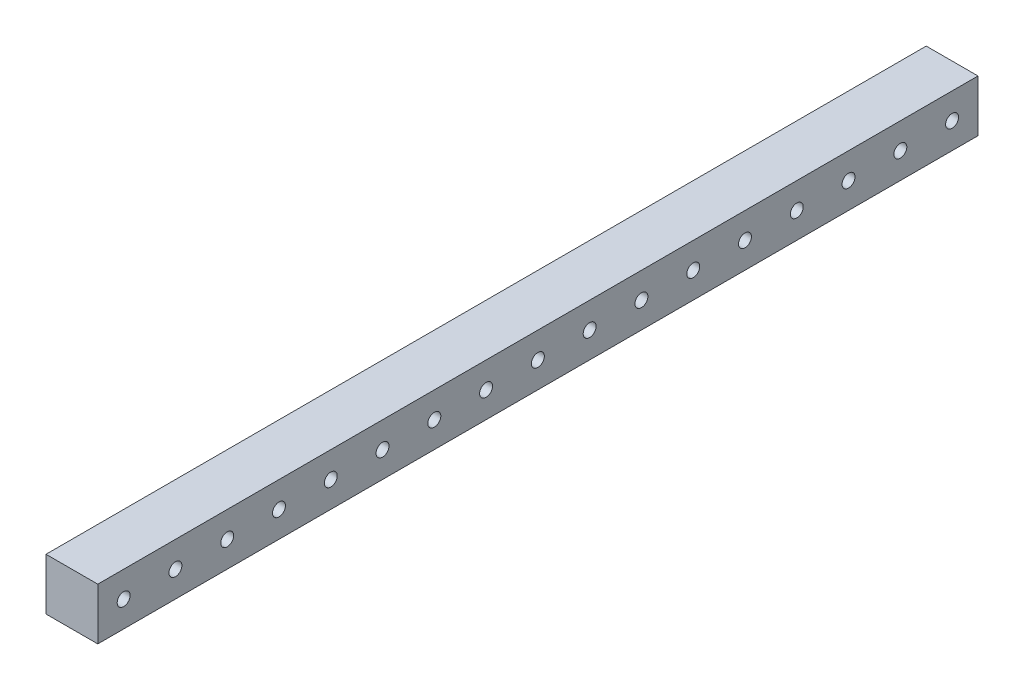
ISO-10303-21;
HEADER;
FILE_DESCRIPTION(('STEP AP214'),'2;1');
FILE_NAME('part.step','',(''),(''),'','','');
FILE_SCHEMA(('AUTOMOTIVE_DESIGN { 1 0 10303 214 1 1 1 1 }'));
ENDSEC;
DATA;
#1=APPLICATION_CONTEXT('core data for automotive mechanical design processes');
#2=APPLICATION_PROTOCOL_DEFINITION('international standard','automotive_design',2000,#1);
#3=PRODUCT_CONTEXT('',#1,'mechanical');
#4=PRODUCT('Part','Part','',(#3));
#5=PRODUCT_RELATED_PRODUCT_CATEGORY('part','',(#4));
#6=PRODUCT_DEFINITION_FORMATION('','',#4);
#7=PRODUCT_DEFINITION_CONTEXT('part definition',#1,'design');
#8=PRODUCT_DEFINITION('design','',#6,#7);
#9=PRODUCT_DEFINITION_SHAPE('','',#8);
#10=(LENGTH_UNIT() NAMED_UNIT(*) SI_UNIT(.MILLI.,.METRE.));
#11=(NAMED_UNIT(*) PLANE_ANGLE_UNIT() SI_UNIT($,.RADIAN.));
#12=(NAMED_UNIT(*) SI_UNIT($,.STERADIAN.) SOLID_ANGLE_UNIT());
#13=UNCERTAINTY_MEASURE_WITH_UNIT(LENGTH_MEASURE(1.E-05),#10,'distance_accuracy_value','');
#14=(GEOMETRIC_REPRESENTATION_CONTEXT(3) GLOBAL_UNCERTAINTY_ASSIGNED_CONTEXT((#13)) GLOBAL_UNIT_ASSIGNED_CONTEXT((#10,
#11,#12)) REPRESENTATION_CONTEXT('',''));
#15=CARTESIAN_POINT('',(0.,0.,0.));
#16=DIRECTION('',(0.,0.,1.));
#17=DIRECTION('',(1.,0.,0.));
#18=AXIS2_PLACEMENT_3D('',#15,#16,#17);
#19=CARTESIAN_POINT('',(10.,0.,330.));
#20=DIRECTION('',(1.,0.,0.));
#21=DIRECTION('',(0.,0.,-1.));
#22=AXIS2_PLACEMENT_3D('',#19,#20,#21);
#23=CYLINDRICAL_SURFACE('',#22,2.5);
#24=CARTESIAN_POINT('',(-10.,0.,330.));
#25=DIRECTION('',(1.,0.,0.));
#26=DIRECTION('',(0.,0.,-1.));
#27=AXIS2_PLACEMENT_3D('',#24,#25,#26);
#28=CIRCLE('',#27,2.5);
#29=CARTESIAN_POINT('',(-10.,0.,327.5));
#30=VERTEX_POINT('',#29);
#31=EDGE_CURVE('E40',#30,#30,#28,.T.);
#32=ORIENTED_EDGE('',*,*,#31,.F.);
#33=EDGE_LOOP('',(#32));
#34=FACE_BOUND('',#33,.T.);
#35=CARTESIAN_POINT('',(10.,0.,330.));
#36=DIRECTION('',(1.,0.,0.));
#37=DIRECTION('',(0.,0.,-1.));
#38=AXIS2_PLACEMENT_3D('',#35,#36,#37);
#39=CIRCLE('',#38,2.5);
#40=CARTESIAN_POINT('',(10.,0.,327.5));
#41=VERTEX_POINT('',#40);
#42=EDGE_CURVE('E11',#41,#41,#39,.T.);
#43=ORIENTED_EDGE('',*,*,#42,.T.);
#44=EDGE_LOOP('',(#43));
#45=FACE_BOUND('',#44,.T.);
#46=ADVANCED_FACE('F32',(#34,#45),#23,.F.);
#47=CARTESIAN_POINT('',(10.,0.,310.));
#48=DIRECTION('',(1.,0.,0.));
#49=DIRECTION('',(0.,0.,-1.));
#50=AXIS2_PLACEMENT_3D('',#47,#48,#49);
#51=CYLINDRICAL_SURFACE('',#50,2.5);
#52=CARTESIAN_POINT('',(-10.,0.,310.));
#53=DIRECTION('',(1.,0.,0.));
#54=DIRECTION('',(0.,0.,-1.));
#55=AXIS2_PLACEMENT_3D('',#52,#53,#54);
#56=CIRCLE('',#55,2.5);
#57=CARTESIAN_POINT('',(-10.,0.,307.5));
#58=VERTEX_POINT('',#57);
#59=EDGE_CURVE('E188',#58,#58,#56,.T.);
#60=ORIENTED_EDGE('',*,*,#59,.F.);
#61=EDGE_LOOP('',(#60));
#62=FACE_BOUND('',#61,.T.);
#63=CARTESIAN_POINT('',(10.,0.,310.));
#64=DIRECTION('',(1.,0.,0.));
#65=DIRECTION('',(0.,0.,-1.));
#66=AXIS2_PLACEMENT_3D('',#63,#64,#65);
#67=CIRCLE('',#66,2.5);
#68=CARTESIAN_POINT('',(10.,0.,307.5));
#69=VERTEX_POINT('',#68);
#70=EDGE_CURVE('E191',#69,#69,#67,.T.);
#71=ORIENTED_EDGE('',*,*,#70,.T.);
#72=EDGE_LOOP('',(#71));
#73=FACE_BOUND('',#72,.T.);
#74=ADVANCED_FACE('F200',(#62,#73),#51,.F.);
#75=CARTESIAN_POINT('',(10.,0.,290.));
#76=DIRECTION('',(1.,0.,0.));
#77=DIRECTION('',(0.,0.,-1.));
#78=AXIS2_PLACEMENT_3D('',#75,#76,#77);
#79=CYLINDRICAL_SURFACE('',#78,2.5);
#80=CARTESIAN_POINT('',(-10.,0.,290.));
#81=DIRECTION('',(1.,0.,0.));
#82=DIRECTION('',(0.,0.,-1.));
#83=AXIS2_PLACEMENT_3D('',#80,#81,#82);
#84=CIRCLE('',#83,2.5);
#85=CARTESIAN_POINT('',(-10.,0.,287.5));
#86=VERTEX_POINT('',#85);
#87=EDGE_CURVE('E182',#86,#86,#84,.T.);
#88=ORIENTED_EDGE('',*,*,#87,.F.);
#89=EDGE_LOOP('',(#88));
#90=FACE_BOUND('',#89,.T.);
#91=CARTESIAN_POINT('',(10.,0.,290.));
#92=DIRECTION('',(1.,0.,0.));
#93=DIRECTION('',(0.,0.,-1.));
#94=AXIS2_PLACEMENT_3D('',#91,#92,#93);
#95=CIRCLE('',#94,2.5);
#96=CARTESIAN_POINT('',(10.,0.,287.5));
#97=VERTEX_POINT('',#96);
#98=EDGE_CURVE('E185',#97,#97,#95,.T.);
#99=ORIENTED_EDGE('',*,*,#98,.T.);
#100=EDGE_LOOP('',(#99));
#101=FACE_BOUND('',#100,.T.);
#102=ADVANCED_FACE('F267',(#90,#101),#79,.F.);
#103=CARTESIAN_POINT('',(10.,0.,270.));
#104=DIRECTION('',(1.,0.,0.));
#105=DIRECTION('',(0.,0.,-1.));
#106=AXIS2_PLACEMENT_3D('',#103,#104,#105);
#107=CYLINDRICAL_SURFACE('',#106,2.5);
#108=CARTESIAN_POINT('',(-10.,0.,270.));
#109=DIRECTION('',(1.,0.,0.));
#110=DIRECTION('',(0.,0.,-1.));
#111=AXIS2_PLACEMENT_3D('',#108,#109,#110);
#112=CIRCLE('',#111,2.5);
#113=CARTESIAN_POINT('',(-10.,0.,267.5));
#114=VERTEX_POINT('',#113);
#115=EDGE_CURVE('E176',#114,#114,#112,.T.);
#116=ORIENTED_EDGE('',*,*,#115,.F.);
#117=EDGE_LOOP('',(#116));
#118=FACE_BOUND('',#117,.T.);
#119=CARTESIAN_POINT('',(10.,0.,270.));
#120=DIRECTION('',(1.,0.,0.));
#121=DIRECTION('',(0.,0.,-1.));
#122=AXIS2_PLACEMENT_3D('',#119,#120,#121);
#123=CIRCLE('',#122,2.5);
#124=CARTESIAN_POINT('',(10.,0.,267.5));
#125=VERTEX_POINT('',#124);
#126=EDGE_CURVE('E179',#125,#125,#123,.T.);
#127=ORIENTED_EDGE('',*,*,#126,.T.);
#128=EDGE_LOOP('',(#127));
#129=FACE_BOUND('',#128,.T.);
#130=ADVANCED_FACE('F263',(#118,#129),#107,.F.);
#131=CARTESIAN_POINT('',(10.,0.,250.));
#132=DIRECTION('',(1.,0.,0.));
#133=DIRECTION('',(0.,0.,-1.));
#134=AXIS2_PLACEMENT_3D('',#131,#132,#133);
#135=CYLINDRICAL_SURFACE('',#134,2.5);
#136=CARTESIAN_POINT('',(-10.,0.,250.));
#137=DIRECTION('',(1.,0.,0.));
#138=DIRECTION('',(0.,0.,-1.));
#139=AXIS2_PLACEMENT_3D('',#136,#137,#138);
#140=CIRCLE('',#139,2.5);
#141=CARTESIAN_POINT('',(-10.,0.,247.5));
#142=VERTEX_POINT('',#141);
#143=EDGE_CURVE('E170',#142,#142,#140,.T.);
#144=ORIENTED_EDGE('',*,*,#143,.F.);
#145=EDGE_LOOP('',(#144));
#146=FACE_BOUND('',#145,.T.);
#147=CARTESIAN_POINT('',(10.,0.,250.));
#148=DIRECTION('',(1.,0.,0.));
#149=DIRECTION('',(0.,0.,-1.));
#150=AXIS2_PLACEMENT_3D('',#147,#148,#149);
#151=CIRCLE('',#150,2.5);
#152=CARTESIAN_POINT('',(10.,0.,247.5));
#153=VERTEX_POINT('',#152);
#154=EDGE_CURVE('E173',#153,#153,#151,.T.);
#155=ORIENTED_EDGE('',*,*,#154,.T.);
#156=EDGE_LOOP('',(#155));
#157=FACE_BOUND('',#156,.T.);
#158=ADVANCED_FACE('F259',(#146,#157),#135,.F.);
#159=CARTESIAN_POINT('',(10.,0.,230.));
#160=DIRECTION('',(1.,0.,0.));
#161=DIRECTION('',(0.,0.,-1.));
#162=AXIS2_PLACEMENT_3D('',#159,#160,#161);
#163=CYLINDRICAL_SURFACE('',#162,2.5);
#164=CARTESIAN_POINT('',(-10.,0.,230.));
#165=DIRECTION('',(1.,0.,0.));
#166=DIRECTION('',(0.,0.,-1.));
#167=AXIS2_PLACEMENT_3D('',#164,#165,#166);
#168=CIRCLE('',#167,2.5);
#169=CARTESIAN_POINT('',(-10.,0.,227.5));
#170=VERTEX_POINT('',#169);
#171=EDGE_CURVE('E164',#170,#170,#168,.T.);
#172=ORIENTED_EDGE('',*,*,#171,.F.);
#173=EDGE_LOOP('',(#172));
#174=FACE_BOUND('',#173,.T.);
#175=CARTESIAN_POINT('',(10.,0.,230.));
#176=DIRECTION('',(1.,0.,0.));
#177=DIRECTION('',(0.,0.,-1.));
#178=AXIS2_PLACEMENT_3D('',#175,#176,#177);
#179=CIRCLE('',#178,2.5);
#180=CARTESIAN_POINT('',(10.,0.,227.5));
#181=VERTEX_POINT('',#180);
#182=EDGE_CURVE('E167',#181,#181,#179,.T.);
#183=ORIENTED_EDGE('',*,*,#182,.T.);
#184=EDGE_LOOP('',(#183));
#185=FACE_BOUND('',#184,.T.);
#186=ADVANCED_FACE('F255',(#174,#185),#163,.F.);
#187=CARTESIAN_POINT('',(10.,0.,210.));
#188=DIRECTION('',(1.,0.,0.));
#189=DIRECTION('',(0.,0.,-1.));
#190=AXIS2_PLACEMENT_3D('',#187,#188,#189);
#191=CYLINDRICAL_SURFACE('',#190,2.5);
#192=CARTESIAN_POINT('',(-10.,0.,210.));
#193=DIRECTION('',(1.,0.,0.));
#194=DIRECTION('',(0.,0.,-1.));
#195=AXIS2_PLACEMENT_3D('',#192,#193,#194);
#196=CIRCLE('',#195,2.5);
#197=CARTESIAN_POINT('',(-10.,0.,207.5));
#198=VERTEX_POINT('',#197);
#199=EDGE_CURVE('E158',#198,#198,#196,.T.);
#200=ORIENTED_EDGE('',*,*,#199,.F.);
#201=EDGE_LOOP('',(#200));
#202=FACE_BOUND('',#201,.T.);
#203=CARTESIAN_POINT('',(10.,0.,210.));
#204=DIRECTION('',(1.,0.,0.));
#205=DIRECTION('',(0.,0.,-1.));
#206=AXIS2_PLACEMENT_3D('',#203,#204,#205);
#207=CIRCLE('',#206,2.5);
#208=CARTESIAN_POINT('',(10.,0.,207.5));
#209=VERTEX_POINT('',#208);
#210=EDGE_CURVE('E161',#209,#209,#207,.T.);
#211=ORIENTED_EDGE('',*,*,#210,.T.);
#212=EDGE_LOOP('',(#211));
#213=FACE_BOUND('',#212,.T.);
#214=ADVANCED_FACE('F251',(#202,#213),#191,.F.);
#215=CARTESIAN_POINT('',(10.,0.,190.));
#216=DIRECTION('',(1.,0.,0.));
#217=DIRECTION('',(0.,0.,-1.));
#218=AXIS2_PLACEMENT_3D('',#215,#216,#217);
#219=CYLINDRICAL_SURFACE('',#218,2.5);
#220=CARTESIAN_POINT('',(-10.,0.,190.));
#221=DIRECTION('',(1.,0.,0.));
#222=DIRECTION('',(0.,0.,-1.));
#223=AXIS2_PLACEMENT_3D('',#220,#221,#222);
#224=CIRCLE('',#223,2.5);
#225=CARTESIAN_POINT('',(-10.,0.,187.5));
#226=VERTEX_POINT('',#225);
#227=EDGE_CURVE('E152',#226,#226,#224,.T.);
#228=ORIENTED_EDGE('',*,*,#227,.F.);
#229=EDGE_LOOP('',(#228));
#230=FACE_BOUND('',#229,.T.);
#231=CARTESIAN_POINT('',(10.,0.,190.));
#232=DIRECTION('',(1.,0.,0.));
#233=DIRECTION('',(0.,0.,-1.));
#234=AXIS2_PLACEMENT_3D('',#231,#232,#233);
#235=CIRCLE('',#234,2.5);
#236=CARTESIAN_POINT('',(10.,0.,187.5));
#237=VERTEX_POINT('',#236);
#238=EDGE_CURVE('E155',#237,#237,#235,.T.);
#239=ORIENTED_EDGE('',*,*,#238,.T.);
#240=EDGE_LOOP('',(#239));
#241=FACE_BOUND('',#240,.T.);
#242=ADVANCED_FACE('F247',(#230,#241),#219,.F.);
#243=CARTESIAN_POINT('',(10.,0.,170.));
#244=DIRECTION('',(1.,0.,0.));
#245=DIRECTION('',(0.,0.,-1.));
#246=AXIS2_PLACEMENT_3D('',#243,#244,#245);
#247=CYLINDRICAL_SURFACE('',#246,2.5);
#248=CARTESIAN_POINT('',(-10.,0.,170.));
#249=DIRECTION('',(1.,0.,0.));
#250=DIRECTION('',(0.,0.,-1.));
#251=AXIS2_PLACEMENT_3D('',#248,#249,#250);
#252=CIRCLE('',#251,2.5);
#253=CARTESIAN_POINT('',(-10.,0.,167.5));
#254=VERTEX_POINT('',#253);
#255=EDGE_CURVE('E146',#254,#254,#252,.T.);
#256=ORIENTED_EDGE('',*,*,#255,.F.);
#257=EDGE_LOOP('',(#256));
#258=FACE_BOUND('',#257,.T.);
#259=CARTESIAN_POINT('',(10.,0.,170.));
#260=DIRECTION('',(1.,0.,0.));
#261=DIRECTION('',(0.,0.,-1.));
#262=AXIS2_PLACEMENT_3D('',#259,#260,#261);
#263=CIRCLE('',#262,2.5);
#264=CARTESIAN_POINT('',(10.,0.,167.5));
#265=VERTEX_POINT('',#264);
#266=EDGE_CURVE('E149',#265,#265,#263,.T.);
#267=ORIENTED_EDGE('',*,*,#266,.T.);
#268=EDGE_LOOP('',(#267));
#269=FACE_BOUND('',#268,.T.);
#270=ADVANCED_FACE('F243',(#258,#269),#247,.F.);
#271=CARTESIAN_POINT('',(10.,0.,150.));
#272=DIRECTION('',(1.,0.,0.));
#273=DIRECTION('',(0.,0.,-1.));
#274=AXIS2_PLACEMENT_3D('',#271,#272,#273);
#275=CYLINDRICAL_SURFACE('',#274,2.5);
#276=CARTESIAN_POINT('',(-10.,0.,150.));
#277=DIRECTION('',(1.,0.,0.));
#278=DIRECTION('',(0.,0.,-1.));
#279=AXIS2_PLACEMENT_3D('',#276,#277,#278);
#280=CIRCLE('',#279,2.5);
#281=CARTESIAN_POINT('',(-10.,0.,147.5));
#282=VERTEX_POINT('',#281);
#283=EDGE_CURVE('E140',#282,#282,#280,.T.);
#284=ORIENTED_EDGE('',*,*,#283,.F.);
#285=EDGE_LOOP('',(#284));
#286=FACE_BOUND('',#285,.T.);
#287=CARTESIAN_POINT('',(10.,0.,150.));
#288=DIRECTION('',(1.,0.,0.));
#289=DIRECTION('',(0.,0.,-1.));
#290=AXIS2_PLACEMENT_3D('',#287,#288,#289);
#291=CIRCLE('',#290,2.5);
#292=CARTESIAN_POINT('',(10.,0.,147.5));
#293=VERTEX_POINT('',#292);
#294=EDGE_CURVE('E143',#293,#293,#291,.T.);
#295=ORIENTED_EDGE('',*,*,#294,.T.);
#296=EDGE_LOOP('',(#295));
#297=FACE_BOUND('',#296,.T.);
#298=ADVANCED_FACE('F239',(#286,#297),#275,.F.);
#299=CARTESIAN_POINT('',(10.,0.,130.));
#300=DIRECTION('',(1.,0.,0.));
#301=DIRECTION('',(0.,0.,-1.));
#302=AXIS2_PLACEMENT_3D('',#299,#300,#301);
#303=CYLINDRICAL_SURFACE('',#302,2.5);
#304=CARTESIAN_POINT('',(-10.,0.,130.));
#305=DIRECTION('',(1.,0.,0.));
#306=DIRECTION('',(0.,0.,-1.));
#307=AXIS2_PLACEMENT_3D('',#304,#305,#306);
#308=CIRCLE('',#307,2.5);
#309=CARTESIAN_POINT('',(-10.,0.,127.5));
#310=VERTEX_POINT('',#309);
#311=EDGE_CURVE('E134',#310,#310,#308,.T.);
#312=ORIENTED_EDGE('',*,*,#311,.F.);
#313=EDGE_LOOP('',(#312));
#314=FACE_BOUND('',#313,.T.);
#315=CARTESIAN_POINT('',(10.,0.,130.));
#316=DIRECTION('',(1.,0.,0.));
#317=DIRECTION('',(0.,0.,-1.));
#318=AXIS2_PLACEMENT_3D('',#315,#316,#317);
#319=CIRCLE('',#318,2.5);
#320=CARTESIAN_POINT('',(10.,0.,127.5));
#321=VERTEX_POINT('',#320);
#322=EDGE_CURVE('E137',#321,#321,#319,.T.);
#323=ORIENTED_EDGE('',*,*,#322,.T.);
#324=EDGE_LOOP('',(#323));
#325=FACE_BOUND('',#324,.T.);
#326=ADVANCED_FACE('F235',(#314,#325),#303,.F.);
#327=CARTESIAN_POINT('',(10.,0.,110.));
#328=DIRECTION('',(1.,0.,0.));
#329=DIRECTION('',(0.,0.,-1.));
#330=AXIS2_PLACEMENT_3D('',#327,#328,#329);
#331=CYLINDRICAL_SURFACE('',#330,2.5);
#332=CARTESIAN_POINT('',(-10.,0.,110.));
#333=DIRECTION('',(1.,0.,0.));
#334=DIRECTION('',(0.,0.,-1.));
#335=AXIS2_PLACEMENT_3D('',#332,#333,#334);
#336=CIRCLE('',#335,2.5);
#337=CARTESIAN_POINT('',(-10.,0.,107.5));
#338=VERTEX_POINT('',#337);
#339=EDGE_CURVE('E128',#338,#338,#336,.T.);
#340=ORIENTED_EDGE('',*,*,#339,.F.);
#341=EDGE_LOOP('',(#340));
#342=FACE_BOUND('',#341,.T.);
#343=CARTESIAN_POINT('',(10.,0.,110.));
#344=DIRECTION('',(1.,0.,0.));
#345=DIRECTION('',(0.,0.,-1.));
#346=AXIS2_PLACEMENT_3D('',#343,#344,#345);
#347=CIRCLE('',#346,2.5);
#348=CARTESIAN_POINT('',(10.,0.,107.5));
#349=VERTEX_POINT('',#348);
#350=EDGE_CURVE('E131',#349,#349,#347,.T.);
#351=ORIENTED_EDGE('',*,*,#350,.T.);
#352=EDGE_LOOP('',(#351));
#353=FACE_BOUND('',#352,.T.);
#354=ADVANCED_FACE('F231',(#342,#353),#331,.F.);
#355=CARTESIAN_POINT('',(10.,0.,90.));
#356=DIRECTION('',(1.,0.,0.));
#357=DIRECTION('',(0.,0.,-1.));
#358=AXIS2_PLACEMENT_3D('',#355,#356,#357);
#359=CYLINDRICAL_SURFACE('',#358,2.5);
#360=CARTESIAN_POINT('',(-10.,0.,90.));
#361=DIRECTION('',(1.,0.,0.));
#362=DIRECTION('',(0.,0.,-1.));
#363=AXIS2_PLACEMENT_3D('',#360,#361,#362);
#364=CIRCLE('',#363,2.5);
#365=CARTESIAN_POINT('',(-10.,0.,87.5));
#366=VERTEX_POINT('',#365);
#367=EDGE_CURVE('E122',#366,#366,#364,.T.);
#368=ORIENTED_EDGE('',*,*,#367,.F.);
#369=EDGE_LOOP('',(#368));
#370=FACE_BOUND('',#369,.T.);
#371=CARTESIAN_POINT('',(10.,0.,90.));
#372=DIRECTION('',(1.,0.,0.));
#373=DIRECTION('',(0.,0.,-1.));
#374=AXIS2_PLACEMENT_3D('',#371,#372,#373);
#375=CIRCLE('',#374,2.5);
#376=CARTESIAN_POINT('',(10.,0.,87.5));
#377=VERTEX_POINT('',#376);
#378=EDGE_CURVE('E125',#377,#377,#375,.T.);
#379=ORIENTED_EDGE('',*,*,#378,.T.);
#380=EDGE_LOOP('',(#379));
#381=FACE_BOUND('',#380,.T.);
#382=ADVANCED_FACE('F227',(#370,#381),#359,.F.);
#383=CARTESIAN_POINT('',(10.,0.,70.));
#384=DIRECTION('',(1.,0.,0.));
#385=DIRECTION('',(0.,0.,-1.));
#386=AXIS2_PLACEMENT_3D('',#383,#384,#385);
#387=CYLINDRICAL_SURFACE('',#386,2.5);
#388=CARTESIAN_POINT('',(-10.,0.,70.));
#389=DIRECTION('',(1.,0.,0.));
#390=DIRECTION('',(0.,0.,-1.));
#391=AXIS2_PLACEMENT_3D('',#388,#389,#390);
#392=CIRCLE('',#391,2.5);
#393=CARTESIAN_POINT('',(-10.,0.,67.5));
#394=VERTEX_POINT('',#393);
#395=EDGE_CURVE('E116',#394,#394,#392,.T.);
#396=ORIENTED_EDGE('',*,*,#395,.F.);
#397=EDGE_LOOP('',(#396));
#398=FACE_BOUND('',#397,.T.);
#399=CARTESIAN_POINT('',(10.,0.,70.));
#400=DIRECTION('',(1.,0.,0.));
#401=DIRECTION('',(0.,0.,-1.));
#402=AXIS2_PLACEMENT_3D('',#399,#400,#401);
#403=CIRCLE('',#402,2.5);
#404=CARTESIAN_POINT('',(10.,0.,67.5));
#405=VERTEX_POINT('',#404);
#406=EDGE_CURVE('E119',#405,#405,#403,.T.);
#407=ORIENTED_EDGE('',*,*,#406,.T.);
#408=EDGE_LOOP('',(#407));
#409=FACE_BOUND('',#408,.T.);
#410=ADVANCED_FACE('F223',(#398,#409),#387,.F.);
#411=CARTESIAN_POINT('',(10.,0.,50.));
#412=DIRECTION('',(1.,0.,0.));
#413=DIRECTION('',(0.,0.,-1.));
#414=AXIS2_PLACEMENT_3D('',#411,#412,#413);
#415=CYLINDRICAL_SURFACE('',#414,2.5);
#416=CARTESIAN_POINT('',(-10.,0.,50.));
#417=DIRECTION('',(1.,0.,0.));
#418=DIRECTION('',(0.,0.,-1.));
#419=AXIS2_PLACEMENT_3D('',#416,#417,#418);
#420=CIRCLE('',#419,2.5);
#421=CARTESIAN_POINT('',(-10.,0.,47.5));
#422=VERTEX_POINT('',#421);
#423=EDGE_CURVE('E110',#422,#422,#420,.T.);
#424=ORIENTED_EDGE('',*,*,#423,.F.);
#425=EDGE_LOOP('',(#424));
#426=FACE_BOUND('',#425,.T.);
#427=CARTESIAN_POINT('',(10.,0.,50.));
#428=DIRECTION('',(1.,0.,0.));
#429=DIRECTION('',(0.,0.,-1.));
#430=AXIS2_PLACEMENT_3D('',#427,#428,#429);
#431=CIRCLE('',#430,2.5);
#432=CARTESIAN_POINT('',(10.,0.,47.5));
#433=VERTEX_POINT('',#432);
#434=EDGE_CURVE('E113',#433,#433,#431,.T.);
#435=ORIENTED_EDGE('',*,*,#434,.T.);
#436=EDGE_LOOP('',(#435));
#437=FACE_BOUND('',#436,.T.);
#438=ADVANCED_FACE('F219',(#426,#437),#415,.F.);
#439=CARTESIAN_POINT('',(-10.,10.0000000000001,340.));
#440=DIRECTION('',(1.,0.,0.));
#441=DIRECTION('',(0.,1.,0.));
#442=AXIS2_PLACEMENT_3D('',#439,#440,#441);
#443=PLANE('',#442);
#444=CARTESIAN_POINT('',(-10.,0.,30.));
#445=DIRECTION('',(1.,0.,0.));
#446=DIRECTION('',(0.,0.,-1.));
#447=AXIS2_PLACEMENT_3D('',#444,#445,#446);
#448=CIRCLE('',#447,2.5);
#449=CARTESIAN_POINT('',(-10.,0.,27.5));
#450=VERTEX_POINT('',#449);
#451=EDGE_CURVE('E428',#450,#450,#448,.T.);
#452=ORIENTED_EDGE('',*,*,#451,.T.);
#453=EDGE_LOOP('',(#452));
#454=FACE_BOUND('',#453,.T.);
#455=CARTESIAN_POINT('',(-10.,0.,10.));
#456=DIRECTION('',(1.,0.,0.));
#457=DIRECTION('',(0.,0.,-1.));
#458=AXIS2_PLACEMENT_3D('',#455,#456,#457);
#459=CIRCLE('',#458,2.5);
#460=CARTESIAN_POINT('',(-10.,0.,7.50000000000001));
#461=VERTEX_POINT('',#460);
#462=EDGE_CURVE('E103',#461,#461,#459,.T.);
#463=ORIENTED_EDGE('',*,*,#462,.T.);
#464=EDGE_LOOP('',(#463));
#465=FACE_BOUND('',#464,.T.);
#466=DIRECTION('',(0.,-1.,0.));
#467=VECTOR('',#466,1.);
#468=CARTESIAN_POINT('',(-10.,10.0000000000001,0.));
#469=LINE('',#468,#467);
#470=CARTESIAN_POINT('',(-10.,10.0000000000001,0.));
#471=VERTEX_POINT('',#470);
#472=CARTESIAN_POINT('',(-10.,-10.0000000000001,0.));
#473=VERTEX_POINT('',#472);
#474=EDGE_CURVE('E100',#471,#473,#469,.T.);
#475=ORIENTED_EDGE('',*,*,#474,.T.);
#476=DIRECTION('',(0.,0.,-1.));
#477=VECTOR('',#476,1.);
#478=CARTESIAN_POINT('',(-10.,-10.0000000000001,340.));
#479=LINE('',#478,#477);
#480=CARTESIAN_POINT('',(-10.,-10.0000000000001,340.));
#481=VERTEX_POINT('',#480);
#482=EDGE_CURVE('E90',#481,#473,#479,.T.);
#483=ORIENTED_EDGE('',*,*,#482,.F.);
#484=DIRECTION('',(0.,-1.,0.));
#485=VECTOR('',#484,1.);
#486=CARTESIAN_POINT('',(-10.,10.0000000000001,340.));
#487=LINE('',#486,#485);
#488=CARTESIAN_POINT('',(-10.,10.0000000000001,340.));
#489=VERTEX_POINT('',#488);
#490=EDGE_CURVE('E84',#489,#481,#487,.T.);
#491=ORIENTED_EDGE('',*,*,#490,.F.);
#492=DIRECTION('',(0.,0.,-1.));
#493=VECTOR('',#492,1.);
#494=CARTESIAN_POINT('',(-10.,10.0000000000001,340.));
#495=LINE('',#494,#493);
#496=EDGE_CURVE('E96',#489,#471,#495,.T.);
#497=ORIENTED_EDGE('',*,*,#496,.T.);
#498=EDGE_LOOP('',(#475,#483,#491,#497));
#499=FACE_BOUND('',#498,.T.);
#500=ORIENTED_EDGE('',*,*,#423,.T.);
#501=EDGE_LOOP('',(#500));
#502=FACE_BOUND('',#501,.T.);
#503=ORIENTED_EDGE('',*,*,#395,.T.);
#504=EDGE_LOOP('',(#503));
#505=FACE_BOUND('',#504,.T.);
#506=ORIENTED_EDGE('',*,*,#367,.T.);
#507=EDGE_LOOP('',(#506));
#508=FACE_BOUND('',#507,.T.);
#509=ORIENTED_EDGE('',*,*,#339,.T.);
#510=EDGE_LOOP('',(#509));
#511=FACE_BOUND('',#510,.T.);
#512=ORIENTED_EDGE('',*,*,#311,.T.);
#513=EDGE_LOOP('',(#512));
#514=FACE_BOUND('',#513,.T.);
#515=ORIENTED_EDGE('',*,*,#283,.T.);
#516=EDGE_LOOP('',(#515));
#517=FACE_BOUND('',#516,.T.);
#518=ORIENTED_EDGE('',*,*,#255,.T.);
#519=EDGE_LOOP('',(#518));
#520=FACE_BOUND('',#519,.T.);
#521=ORIENTED_EDGE('',*,*,#227,.T.);
#522=EDGE_LOOP('',(#521));
#523=FACE_BOUND('',#522,.T.);
#524=ORIENTED_EDGE('',*,*,#199,.T.);
#525=EDGE_LOOP('',(#524));
#526=FACE_BOUND('',#525,.T.);
#527=ORIENTED_EDGE('',*,*,#171,.T.);
#528=EDGE_LOOP('',(#527));
#529=FACE_BOUND('',#528,.T.);
#530=ORIENTED_EDGE('',*,*,#143,.T.);
#531=EDGE_LOOP('',(#530));
#532=FACE_BOUND('',#531,.T.);
#533=ORIENTED_EDGE('',*,*,#115,.T.);
#534=EDGE_LOOP('',(#533));
#535=FACE_BOUND('',#534,.T.);
#536=ORIENTED_EDGE('',*,*,#87,.T.);
#537=EDGE_LOOP('',(#536));
#538=FACE_BOUND('',#537,.T.);
#539=ORIENTED_EDGE('',*,*,#59,.T.);
#540=EDGE_LOOP('',(#539));
#541=FACE_BOUND('',#540,.T.);
#542=ORIENTED_EDGE('',*,*,#31,.T.);
#543=EDGE_LOOP('',(#542));
#544=FACE_BOUND('',#543,.T.);
#545=ADVANCED_FACE('F196',(#454,#465,#499,#502,#505,#508,#511,#514,#517,#520,#523,#526,#529,
#532,#535,#538,#541,#544),#443,.F.);
#546=CARTESIAN_POINT('',(-10.,-10.0000000000001,340.));
#547=DIRECTION('',(0.,1.,0.));
#548=DIRECTION('',(0.,0.,1.));
#549=AXIS2_PLACEMENT_3D('',#546,#547,#548);
#550=PLANE('',#549);
#551=DIRECTION('',(1.,0.,0.));
#552=VECTOR('',#551,1.);
#553=CARTESIAN_POINT('',(-10.,-10.0000000000001,0.));
#554=LINE('',#553,#552);
#555=CARTESIAN_POINT('',(10.,-10.0000000000001,0.));
#556=VERTEX_POINT('',#555);
#557=EDGE_CURVE('E89',#473,#556,#554,.T.);
#558=ORIENTED_EDGE('',*,*,#557,.T.);
#559=DIRECTION('',(0.,0.,-1.));
#560=VECTOR('',#559,1.);
#561=CARTESIAN_POINT('',(10.,-10.0000000000001,340.));
#562=LINE('',#561,#560);
#563=CARTESIAN_POINT('',(10.,-10.0000000000001,340.));
#564=VERTEX_POINT('',#563);
#565=EDGE_CURVE('E87',#564,#556,#562,.T.);
#566=ORIENTED_EDGE('',*,*,#565,.F.);
#567=DIRECTION('',(1.,0.,0.));
#568=VECTOR('',#567,1.);
#569=CARTESIAN_POINT('',(-10.,-10.0000000000001,340.));
#570=LINE('',#569,#568);
#571=EDGE_CURVE('E79',#481,#564,#570,.T.);
#572=ORIENTED_EDGE('',*,*,#571,.F.);
#573=ORIENTED_EDGE('',*,*,#482,.T.);
#574=EDGE_LOOP('',(#558,#566,#572,#573));
#575=FACE_BOUND('',#574,.T.);
#576=ADVANCED_FACE('F88',(#575),#550,.F.);
#577=CARTESIAN_POINT('',(10.,10.0000000000001,340.));
#578=DIRECTION('',(-1.,0.,0.));
#579=DIRECTION('',(0.,-1.,0.));
#580=AXIS2_PLACEMENT_3D('',#577,#578,#579);
#581=PLANE('',#580);
#582=CARTESIAN_POINT('',(10.,0.,30.));
#583=DIRECTION('',(1.,0.,0.));
#584=DIRECTION('',(0.,0.,-1.));
#585=AXIS2_PLACEMENT_3D('',#582,#583,#584);
#586=CIRCLE('',#585,2.5);
#587=CARTESIAN_POINT('',(10.,0.,27.5));
#588=VERTEX_POINT('',#587);
#589=EDGE_CURVE('E430',#588,#588,#586,.T.);
#590=ORIENTED_EDGE('',*,*,#589,.F.);
#591=EDGE_LOOP('',(#590));
#592=FACE_BOUND('',#591,.T.);
#593=CARTESIAN_POINT('',(10.,0.,10.));
#594=DIRECTION('',(1.,0.,0.));
#595=DIRECTION('',(0.,0.,-1.));
#596=AXIS2_PLACEMENT_3D('',#593,#594,#595);
#597=CIRCLE('',#596,2.5);
#598=CARTESIAN_POINT('',(10.,0.,7.5));
#599=VERTEX_POINT('',#598);
#600=EDGE_CURVE('E431',#599,#599,#597,.T.);
#601=ORIENTED_EDGE('',*,*,#600,.F.);
#602=EDGE_LOOP('',(#601));
#603=FACE_BOUND('',#602,.T.);
#604=DIRECTION('',(0.,1.,0.));
#605=VECTOR('',#604,1.);
#606=CARTESIAN_POINT('',(10.,10.0000000000001,0.));
#607=LINE('',#606,#605);
#608=CARTESIAN_POINT('',(10.,10.0000000000001,0.));
#609=VERTEX_POINT('',#608);
#610=EDGE_CURVE('E65',#556,#609,#607,.T.);
#611=ORIENTED_EDGE('',*,*,#610,.T.);
#612=DIRECTION('',(0.,0.,-1.));
#613=VECTOR('',#612,1.);
#614=CARTESIAN_POINT('',(10.,10.0000000000001,340.));
#615=LINE('',#614,#613);
#616=CARTESIAN_POINT('',(10.,10.0000000000001,340.));
#617=VERTEX_POINT('',#616);
#618=EDGE_CURVE('E91',#617,#609,#615,.T.);
#619=ORIENTED_EDGE('',*,*,#618,.F.);
#620=DIRECTION('',(0.,1.,0.));
#621=VECTOR('',#620,1.);
#622=CARTESIAN_POINT('',(10.,10.0000000000001,340.));
#623=LINE('',#622,#621);
#624=EDGE_CURVE('E82',#564,#617,#623,.T.);
#625=ORIENTED_EDGE('',*,*,#624,.F.);
#626=ORIENTED_EDGE('',*,*,#565,.T.);
#627=EDGE_LOOP('',(#611,#619,#625,#626));
#628=FACE_BOUND('',#627,.T.);
#629=ORIENTED_EDGE('',*,*,#434,.F.);
#630=EDGE_LOOP('',(#629));
#631=FACE_BOUND('',#630,.T.);
#632=ORIENTED_EDGE('',*,*,#406,.F.);
#633=EDGE_LOOP('',(#632));
#634=FACE_BOUND('',#633,.T.);
#635=ORIENTED_EDGE('',*,*,#378,.F.);
#636=EDGE_LOOP('',(#635));
#637=FACE_BOUND('',#636,.T.);
#638=ORIENTED_EDGE('',*,*,#350,.F.);
#639=EDGE_LOOP('',(#638));
#640=FACE_BOUND('',#639,.T.);
#641=ORIENTED_EDGE('',*,*,#322,.F.);
#642=EDGE_LOOP('',(#641));
#643=FACE_BOUND('',#642,.T.);
#644=ORIENTED_EDGE('',*,*,#294,.F.);
#645=EDGE_LOOP('',(#644));
#646=FACE_BOUND('',#645,.T.);
#647=ORIENTED_EDGE('',*,*,#266,.F.);
#648=EDGE_LOOP('',(#647));
#649=FACE_BOUND('',#648,.T.);
#650=ORIENTED_EDGE('',*,*,#238,.F.);
#651=EDGE_LOOP('',(#650));
#652=FACE_BOUND('',#651,.T.);
#653=ORIENTED_EDGE('',*,*,#210,.F.);
#654=EDGE_LOOP('',(#653));
#655=FACE_BOUND('',#654,.T.);
#656=ORIENTED_EDGE('',*,*,#182,.F.);
#657=EDGE_LOOP('',(#656));
#658=FACE_BOUND('',#657,.T.);
#659=ORIENTED_EDGE('',*,*,#154,.F.);
#660=EDGE_LOOP('',(#659));
#661=FACE_BOUND('',#660,.T.);
#662=ORIENTED_EDGE('',*,*,#126,.F.);
#663=EDGE_LOOP('',(#662));
#664=FACE_BOUND('',#663,.T.);
#665=ORIENTED_EDGE('',*,*,#98,.F.);
#666=EDGE_LOOP('',(#665));
#667=FACE_BOUND('',#666,.T.);
#668=ORIENTED_EDGE('',*,*,#70,.F.);
#669=EDGE_LOOP('',(#668));
#670=FACE_BOUND('',#669,.T.);
#671=ORIENTED_EDGE('',*,*,#42,.F.);
#672=EDGE_LOOP('',(#671));
#673=FACE_BOUND('',#672,.T.);
#674=ADVANCED_FACE('F93',(#592,#603,#628,#631,#634,#637,#640,#643,#646,#649,#652,#655,#658,#661,
#664,#667,#670,#673),#581,.F.);
#675=CARTESIAN_POINT('',(-10.,10.0000000000001,340.));
#676=DIRECTION('',(0.,-1.,0.));
#677=DIRECTION('',(0.,0.,-1.));
#678=AXIS2_PLACEMENT_3D('',#675,#676,#677);
#679=PLANE('',#678);
#680=DIRECTION('',(-1.,0.,0.));
#681=VECTOR('',#680,1.);
#682=CARTESIAN_POINT('',(-10.,10.0000000000001,0.));
#683=LINE('',#682,#681);
#684=EDGE_CURVE('E71',#609,#471,#683,.T.);
#685=ORIENTED_EDGE('',*,*,#684,.T.);
#686=ORIENTED_EDGE('',*,*,#496,.F.);
#687=DIRECTION('',(-1.,0.,0.));
#688=VECTOR('',#687,1.);
#689=CARTESIAN_POINT('',(-10.,10.0000000000001,340.));
#690=LINE('',#689,#688);
#691=EDGE_CURVE('E48',#617,#489,#690,.T.);
#692=ORIENTED_EDGE('',*,*,#691,.F.);
#693=ORIENTED_EDGE('',*,*,#618,.T.);
#694=EDGE_LOOP('',(#685,#686,#692,#693));
#695=FACE_BOUND('',#694,.T.);
#696=ADVANCED_FACE('F204',(#695),#679,.F.);
#697=CARTESIAN_POINT('',(0.,0.,340.));
#698=DIRECTION('',(0.,0.,1.));
#699=DIRECTION('',(1.,0.,0.));
#700=AXIS2_PLACEMENT_3D('',#697,#698,#699);
#701=PLANE('',#700);
#702=ORIENTED_EDGE('',*,*,#490,.T.);
#703=ORIENTED_EDGE('',*,*,#571,.T.);
#704=ORIENTED_EDGE('',*,*,#624,.T.);
#705=ORIENTED_EDGE('',*,*,#691,.T.);
#706=EDGE_LOOP('',(#702,#703,#704,#705));
#707=FACE_BOUND('',#706,.T.);
#708=ADVANCED_FACE('F80',(#707),#701,.T.);
#709=CARTESIAN_POINT('',(0.,0.,0.));
#710=DIRECTION('',(0.,0.,1.));
#711=DIRECTION('',(1.,0.,0.));
#712=AXIS2_PLACEMENT_3D('',#709,#710,#711);
#713=PLANE('',#712);
#714=ORIENTED_EDGE('',*,*,#474,.F.);
#715=ORIENTED_EDGE('',*,*,#684,.F.);
#716=ORIENTED_EDGE('',*,*,#610,.F.);
#717=ORIENTED_EDGE('',*,*,#557,.F.);
#718=EDGE_LOOP('',(#714,#715,#716,#717));
#719=FACE_BOUND('',#718,.T.);
#720=ADVANCED_FACE('F358',(#719),#713,.F.);
#721=CARTESIAN_POINT('',(10.,0.,10.));
#722=DIRECTION('',(1.,0.,0.));
#723=DIRECTION('',(0.,0.,-1.));
#724=AXIS2_PLACEMENT_3D('',#721,#722,#723);
#725=CYLINDRICAL_SURFACE('',#724,2.5);
#726=ORIENTED_EDGE('',*,*,#462,.F.);
#727=EDGE_LOOP('',(#726));
#728=FACE_BOUND('',#727,.T.);
#729=ORIENTED_EDGE('',*,*,#600,.T.);
#730=EDGE_LOOP('',(#729));
#731=FACE_BOUND('',#730,.T.);
#732=ADVANCED_FACE('F367',(#728,#731),#725,.F.);
#733=CARTESIAN_POINT('',(10.,0.,30.));
#734=DIRECTION('',(1.,0.,0.));
#735=DIRECTION('',(0.,0.,-1.));
#736=AXIS2_PLACEMENT_3D('',#733,#734,#735);
#737=CYLINDRICAL_SURFACE('',#736,2.5);
#738=ORIENTED_EDGE('',*,*,#451,.F.);
#739=EDGE_LOOP('',(#738));
#740=FACE_BOUND('',#739,.T.);
#741=ORIENTED_EDGE('',*,*,#589,.T.);
#742=EDGE_LOOP('',(#741));
#743=FACE_BOUND('',#742,.T.);
#744=ADVANCED_FACE('F375',(#740,#743),#737,.F.);
#745=CLOSED_SHELL('',(#46,#74,#102,#130,#158,#186,#214,#242,#270,#298,#326,#354,#382,#410,#438,
#545,#576,#674,#696,#708,#720,#732,#744));
#746=MANIFOLD_SOLID_BREP('B2',#745);
#747=ADVANCED_BREP_SHAPE_REPRESENTATION('',(#18,#746),#14);
#748=SHAPE_DEFINITION_REPRESENTATION(#9,#747);
ENDSEC;
END-ISO-10303-21;
